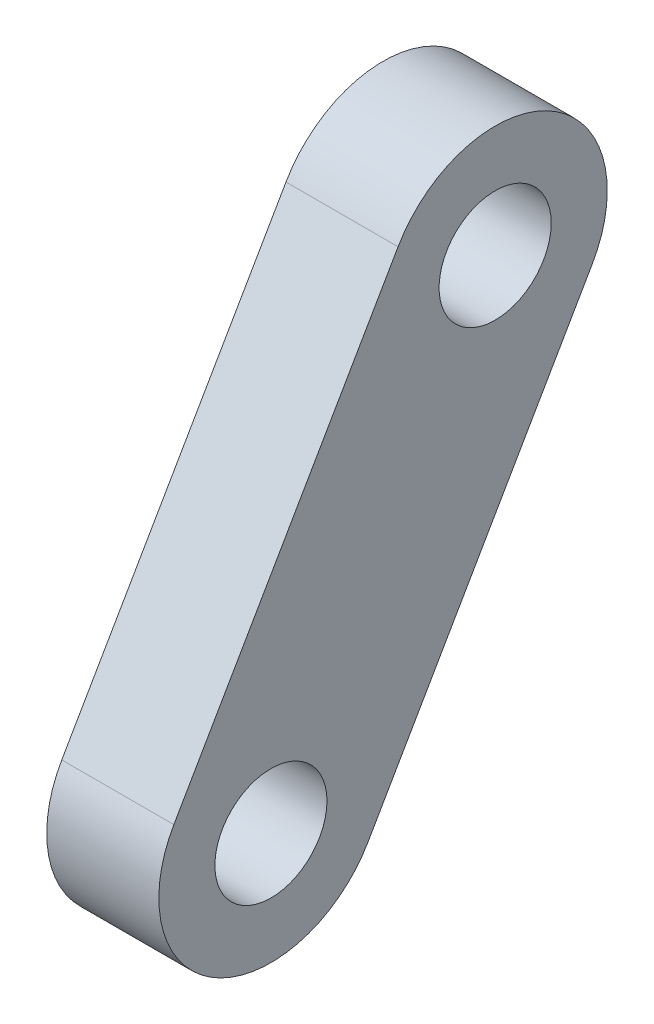
ISO-10303-21;
HEADER;
FILE_DESCRIPTION(('STEP AP214'),'2;1');
FILE_NAME('part.step','',(''),(''),'','','');
FILE_SCHEMA(('AUTOMOTIVE_DESIGN { 1 0 10303 214 1 1 1 1 }'));
ENDSEC;
DATA;
#1=APPLICATION_CONTEXT('core data for automotive mechanical design processes');
#2=APPLICATION_PROTOCOL_DEFINITION('international standard','automotive_design',2000,#1);
#3=PRODUCT_CONTEXT('',#1,'mechanical');
#4=PRODUCT('Part','Part','',(#3));
#5=PRODUCT_RELATED_PRODUCT_CATEGORY('part','',(#4));
#6=PRODUCT_DEFINITION_FORMATION('','',#4);
#7=PRODUCT_DEFINITION_CONTEXT('part definition',#1,'design');
#8=PRODUCT_DEFINITION('design','',#6,#7);
#9=PRODUCT_DEFINITION_SHAPE('','',#8);
#10=(LENGTH_UNIT() NAMED_UNIT(*) SI_UNIT(.MILLI.,.METRE.));
#11=(NAMED_UNIT(*) PLANE_ANGLE_UNIT() SI_UNIT($,.RADIAN.));
#12=(NAMED_UNIT(*) SI_UNIT($,.STERADIAN.) SOLID_ANGLE_UNIT());
#13=UNCERTAINTY_MEASURE_WITH_UNIT(LENGTH_MEASURE(1.E-05),#10,'distance_accuracy_value','');
#14=(GEOMETRIC_REPRESENTATION_CONTEXT(3) GLOBAL_UNCERTAINTY_ASSIGNED_CONTEXT((#13)) GLOBAL_UNIT_ASSIGNED_CONTEXT((#10,
#11,#12)) REPRESENTATION_CONTEXT('',''));
#15=CARTESIAN_POINT('',(0.,0.,0.));
#16=DIRECTION('',(0.,0.,1.));
#17=DIRECTION('',(1.,0.,0.));
#18=AXIS2_PLACEMENT_3D('',#15,#16,#17);
#19=CARTESIAN_POINT('',(5.,-2.49999999999999,-4.3301270189222));
#20=DIRECTION('',(0.,0.499999999999998,0.86602540378444));
#21=DIRECTION('',(0.,-0.86602540378444,0.499999999999998));
#22=AXIS2_PLACEMENT_3D('',#19,#20,#21);
#23=PLANE('',#22);
#24=DIRECTION('',(0.,0.86602540378444,-0.499999999999998));
#25=VECTOR('',#24,1.);
#26=CARTESIAN_POINT('',(0.,-2.49999999999999,-4.3301270189222));
#27=LINE('',#26,#25);
#28=CARTESIAN_POINT('',(0.,-2.49999999999999,-4.3301270189222));
#29=VERTEX_POINT('',#28);
#30=CARTESIAN_POINT('',(0.,14.8205080756888,-14.3301270189222));
#31=VERTEX_POINT('',#30);
#32=EDGE_CURVE('E117',#29,#31,#27,.T.);
#33=ORIENTED_EDGE('',*,*,#32,.T.);
#34=DIRECTION('',(-1.,0.,0.));
#35=VECTOR('',#34,1.);
#36=CARTESIAN_POINT('',(5.,14.8205080756888,-14.3301270189222));
#37=LINE('',#36,#35);
#38=CARTESIAN_POINT('',(5.,14.8205080756888,-14.3301270189222));
#39=VERTEX_POINT('',#38);
#40=EDGE_CURVE('E11',#39,#31,#37,.T.);
#41=ORIENTED_EDGE('',*,*,#40,.F.);
#42=DIRECTION('',(0.,0.86602540378444,-0.499999999999998));
#43=VECTOR('',#42,1.);
#44=CARTESIAN_POINT('',(5.,-2.49999999999999,-4.3301270189222));
#45=LINE('',#44,#43);
#46=CARTESIAN_POINT('',(5.,-2.49999999999999,-4.3301270189222));
#47=VERTEX_POINT('',#46);
#48=EDGE_CURVE('E90',#47,#39,#45,.T.);
#49=ORIENTED_EDGE('',*,*,#48,.F.);
#50=DIRECTION('',(-1.,0.,0.));
#51=VECTOR('',#50,1.);
#52=CARTESIAN_POINT('',(5.,-2.49999999999999,-4.3301270189222));
#53=LINE('',#52,#51);
#54=EDGE_CURVE('E116',#47,#29,#53,.T.);
#55=ORIENTED_EDGE('',*,*,#54,.T.);
#56=EDGE_LOOP('',(#33,#41,#49,#55));
#57=FACE_BOUND('',#56,.T.);
#58=ADVANCED_FACE('F41',(#57),#23,.F.);
#59=CARTESIAN_POINT('',(5.,17.3205080756888,-9.99999999999996));
#60=DIRECTION('',(-1.,0.,0.));
#61=DIRECTION('',(0.,0.,1.));
#62=AXIS2_PLACEMENT_3D('',#59,#60,#61);
#63=CYLINDRICAL_SURFACE('',#62,5.);
#64=CARTESIAN_POINT('',(0.,17.3205080756888,-9.99999999999996));
#65=DIRECTION('',(1.,0.,0.));
#66=DIRECTION('',(0.,0.,-1.));
#67=AXIS2_PLACEMENT_3D('',#64,#65,#66);
#68=CIRCLE('',#67,5.);
#69=CARTESIAN_POINT('',(0.,19.8205080756888,-5.66987298107776));
#70=VERTEX_POINT('',#69);
#71=EDGE_CURVE('E96',#31,#70,#68,.T.);
#72=ORIENTED_EDGE('',*,*,#71,.T.);
#73=DIRECTION('',(-1.,0.,0.));
#74=VECTOR('',#73,1.);
#75=CARTESIAN_POINT('',(5.,19.8205080756888,-5.66987298107776));
#76=LINE('',#75,#74);
#77=CARTESIAN_POINT('',(5.,19.8205080756888,-5.66987298107776));
#78=VERTEX_POINT('',#77);
#79=EDGE_CURVE('E50',#78,#70,#76,.T.);
#80=ORIENTED_EDGE('',*,*,#79,.F.);
#81=CARTESIAN_POINT('',(5.,17.3205080756888,-9.99999999999996));
#82=DIRECTION('',(1.,0.,0.));
#83=DIRECTION('',(0.,0.,-1.));
#84=AXIS2_PLACEMENT_3D('',#81,#82,#83);
#85=CIRCLE('',#84,5.);
#86=EDGE_CURVE('E84',#39,#78,#85,.T.);
#87=ORIENTED_EDGE('',*,*,#86,.F.);
#88=ORIENTED_EDGE('',*,*,#40,.T.);
#89=EDGE_LOOP('',(#72,#80,#87,#88));
#90=FACE_BOUND('',#89,.T.);
#91=ADVANCED_FACE('F95',(#90),#63,.T.);
#92=CARTESIAN_POINT('',(5.,2.49999999999999,4.3301270189222));
#93=DIRECTION('',(0.,0.499999999999998,0.86602540378444));
#94=DIRECTION('',(0.,-0.86602540378444,0.499999999999998));
#95=AXIS2_PLACEMENT_3D('',#92,#93,#94);
#96=PLANE('',#95);
#97=DIRECTION('',(0.,0.86602540378444,-0.499999999999998));
#98=VECTOR('',#97,1.);
#99=CARTESIAN_POINT('',(0.,2.49999999999999,4.3301270189222));
#100=LINE('',#99,#98);
#101=CARTESIAN_POINT('',(0.,2.49999999999999,4.3301270189222));
#102=VERTEX_POINT('',#101);
#103=EDGE_CURVE('E123',#102,#70,#100,.T.);
#104=ORIENTED_EDGE('',*,*,#103,.F.);
#105=DIRECTION('',(-1.,0.,0.));
#106=VECTOR('',#105,1.);
#107=CARTESIAN_POINT('',(5.,2.49999999999999,4.3301270189222));
#108=LINE('',#107,#106);
#109=CARTESIAN_POINT('',(5.,2.49999999999999,4.3301270189222));
#110=VERTEX_POINT('',#109);
#111=EDGE_CURVE('E74',#110,#102,#108,.T.);
#112=ORIENTED_EDGE('',*,*,#111,.F.);
#113=DIRECTION('',(0.,0.86602540378444,-0.499999999999998));
#114=VECTOR('',#113,1.);
#115=CARTESIAN_POINT('',(5.,2.49999999999999,4.3301270189222));
#116=LINE('',#115,#114);
#117=EDGE_CURVE('E88',#110,#78,#116,.T.);
#118=ORIENTED_EDGE('',*,*,#117,.T.);
#119=ORIENTED_EDGE('',*,*,#79,.T.);
#120=EDGE_LOOP('',(#104,#112,#118,#119));
#121=FACE_BOUND('',#120,.T.);
#122=ADVANCED_FACE('F101',(#121),#96,.T.);
#123=CARTESIAN_POINT('',(5.,0.,0.));
#124=DIRECTION('',(-1.,0.,0.));
#125=DIRECTION('',(0.,0.,1.));
#126=AXIS2_PLACEMENT_3D('',#123,#124,#125);
#127=CYLINDRICAL_SURFACE('',#126,2.5);
#128=CARTESIAN_POINT('',(5.,0.,0.));
#129=DIRECTION('',(1.,0.,0.));
#130=DIRECTION('',(0.,0.,-1.));
#131=AXIS2_PLACEMENT_3D('',#128,#129,#130);
#132=CIRCLE('',#131,2.5);
#133=CARTESIAN_POINT('',(5.,0.,-2.5));
#134=VERTEX_POINT('',#133);
#135=EDGE_CURVE('E105',#134,#134,#132,.T.);
#136=ORIENTED_EDGE('',*,*,#135,.T.);
#137=EDGE_LOOP('',(#136));
#138=FACE_BOUND('',#137,.T.);
#139=CARTESIAN_POINT('',(0.,0.,0.));
#140=DIRECTION('',(1.,0.,0.));
#141=DIRECTION('',(0.,0.,-1.));
#142=AXIS2_PLACEMENT_3D('',#139,#140,#141);
#143=CIRCLE('',#142,2.5);
#144=CARTESIAN_POINT('',(0.,0.,-2.5));
#145=VERTEX_POINT('',#144);
#146=EDGE_CURVE('E128',#145,#145,#143,.T.);
#147=ORIENTED_EDGE('',*,*,#146,.F.);
#148=EDGE_LOOP('',(#147));
#149=FACE_BOUND('',#148,.T.);
#150=ADVANCED_FACE('F160',(#138,#149),#127,.F.);
#151=CARTESIAN_POINT('',(5.,0.,0.));
#152=DIRECTION('',(-1.,0.,0.));
#153=DIRECTION('',(0.,0.,1.));
#154=AXIS2_PLACEMENT_3D('',#151,#152,#153);
#155=CYLINDRICAL_SURFACE('',#154,5.);
#156=CARTESIAN_POINT('',(0.,0.,0.));
#157=DIRECTION('',(1.,0.,0.));
#158=DIRECTION('',(0.,0.,-1.));
#159=AXIS2_PLACEMENT_3D('',#156,#157,#158);
#160=CIRCLE('',#159,5.);
#161=EDGE_CURVE('E77',#102,#29,#160,.T.);
#162=ORIENTED_EDGE('',*,*,#161,.T.);
#163=ORIENTED_EDGE('',*,*,#54,.F.);
#164=CARTESIAN_POINT('',(5.,0.,0.));
#165=DIRECTION('',(1.,0.,0.));
#166=DIRECTION('',(0.,0.,-1.));
#167=AXIS2_PLACEMENT_3D('',#164,#165,#166);
#168=CIRCLE('',#167,5.);
#169=EDGE_CURVE('E58',#110,#47,#168,.T.);
#170=ORIENTED_EDGE('',*,*,#169,.F.);
#171=ORIENTED_EDGE('',*,*,#111,.T.);
#172=EDGE_LOOP('',(#162,#163,#170,#171));
#173=FACE_BOUND('',#172,.T.);
#174=ADVANCED_FACE('F152',(#173),#155,.T.);
#175=CARTESIAN_POINT('',(5.,17.3205080756888,-9.99999999999996));
#176=DIRECTION('',(-1.,0.,0.));
#177=DIRECTION('',(0.,0.,1.));
#178=AXIS2_PLACEMENT_3D('',#175,#176,#177);
#179=CYLINDRICAL_SURFACE('',#178,2.5);
#180=CARTESIAN_POINT('',(5.,17.3205080756888,-9.99999999999996));
#181=DIRECTION('',(1.,0.,0.));
#182=DIRECTION('',(0.,0.,-1.));
#183=AXIS2_PLACEMENT_3D('',#180,#181,#182);
#184=CIRCLE('',#183,2.5);
#185=CARTESIAN_POINT('',(5.,17.3205080756888,-12.5));
#186=VERTEX_POINT('',#185);
#187=EDGE_CURVE('E112',#186,#186,#184,.T.);
#188=ORIENTED_EDGE('',*,*,#187,.T.);
#189=EDGE_LOOP('',(#188));
#190=FACE_BOUND('',#189,.T.);
#191=CARTESIAN_POINT('',(0.,17.3205080756888,-9.99999999999996));
#192=DIRECTION('',(1.,0.,0.));
#193=DIRECTION('',(0.,0.,-1.));
#194=AXIS2_PLACEMENT_3D('',#191,#192,#193);
#195=CIRCLE('',#194,2.5);
#196=CARTESIAN_POINT('',(0.,17.3205080756888,-12.5));
#197=VERTEX_POINT('',#196);
#198=EDGE_CURVE('E132',#197,#197,#195,.T.);
#199=ORIENTED_EDGE('',*,*,#198,.F.);
#200=EDGE_LOOP('',(#199));
#201=FACE_BOUND('',#200,.T.);
#202=ADVANCED_FACE('F150',(#190,#201),#179,.F.);
#203=CARTESIAN_POINT('',(5.,0.,0.));
#204=DIRECTION('',(1.,0.,0.));
#205=DIRECTION('',(0.,0.,-1.));
#206=AXIS2_PLACEMENT_3D('',#203,#204,#205);
#207=PLANE('',#206);
#208=ORIENTED_EDGE('',*,*,#48,.T.);
#209=ORIENTED_EDGE('',*,*,#86,.T.);
#210=ORIENTED_EDGE('',*,*,#117,.F.);
#211=ORIENTED_EDGE('',*,*,#169,.T.);
#212=EDGE_LOOP('',(#208,#209,#210,#211));
#213=FACE_BOUND('',#212,.T.);
#214=ORIENTED_EDGE('',*,*,#135,.F.);
#215=EDGE_LOOP('',(#214));
#216=FACE_BOUND('',#215,.T.);
#217=ORIENTED_EDGE('',*,*,#187,.F.);
#218=EDGE_LOOP('',(#217));
#219=FACE_BOUND('',#218,.T.);
#220=ADVANCED_FACE('F85',(#213,#216,#219),#207,.T.);
#221=CARTESIAN_POINT('',(0.,0.,0.));
#222=DIRECTION('',(1.,0.,0.));
#223=DIRECTION('',(0.,0.,-1.));
#224=AXIS2_PLACEMENT_3D('',#221,#222,#223);
#225=PLANE('',#224);
#226=ORIENTED_EDGE('',*,*,#32,.F.);
#227=ORIENTED_EDGE('',*,*,#161,.F.);
#228=ORIENTED_EDGE('',*,*,#103,.T.);
#229=ORIENTED_EDGE('',*,*,#71,.F.);
#230=EDGE_LOOP('',(#226,#227,#228,#229));
#231=FACE_BOUND('',#230,.T.);
#232=ORIENTED_EDGE('',*,*,#146,.T.);
#233=EDGE_LOOP('',(#232));
#234=FACE_BOUND('',#233,.T.);
#235=ORIENTED_EDGE('',*,*,#198,.T.);
#236=EDGE_LOOP('',(#235));
#237=FACE_BOUND('',#236,.T.);
#238=ADVANCED_FACE('F142',(#231,#234,#237),#225,.F.);
#239=CLOSED_SHELL('',(#58,#91,#122,#150,#174,#202,#220,#238));
#240=MANIFOLD_SOLID_BREP('B2',#239);
#241=ADVANCED_BREP_SHAPE_REPRESENTATION('',(#18,#240),#14);
#242=SHAPE_DEFINITION_REPRESENTATION(#9,#241);
ENDSEC;
END-ISO-10303-21;
